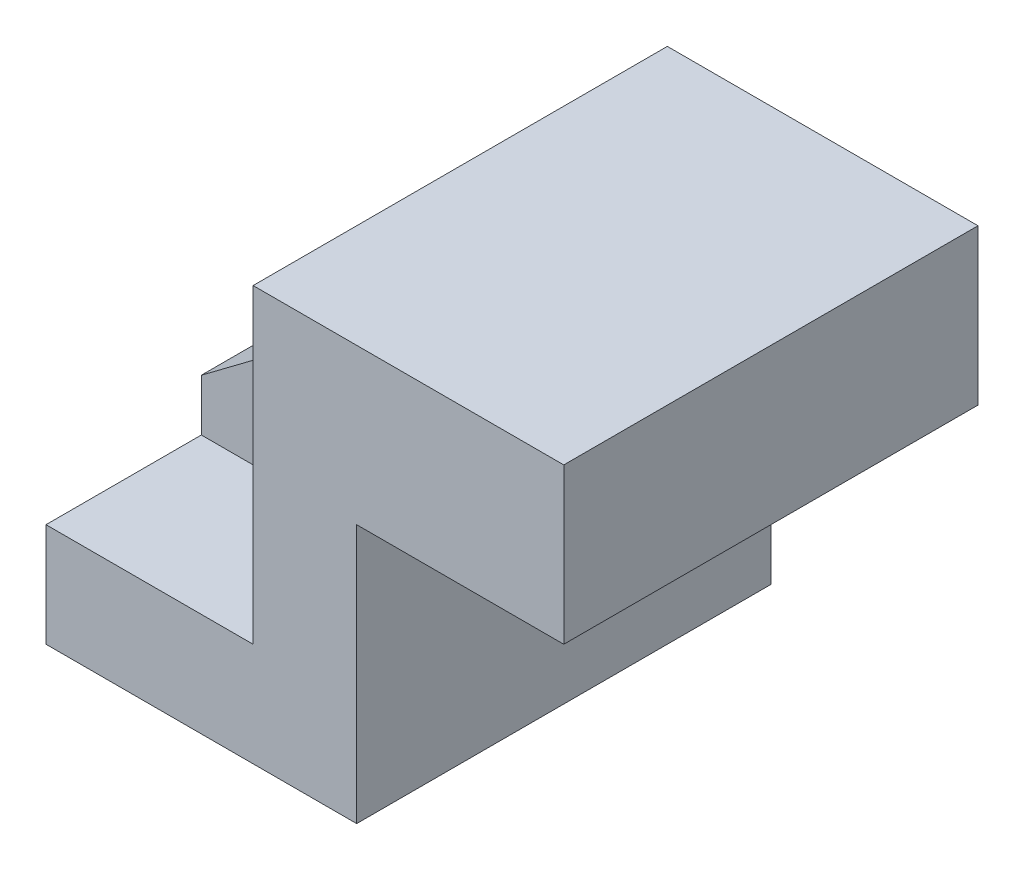
ISO-10303-21;
HEADER;
FILE_DESCRIPTION(('STEP AP214'),'2;1');
FILE_NAME('part.step','',(''),(''),'','','');
FILE_SCHEMA(('AUTOMOTIVE_DESIGN { 1 0 10303 214 1 1 1 1 }'));
ENDSEC;
DATA;
#1=APPLICATION_CONTEXT('core data for automotive mechanical design processes');
#2=APPLICATION_PROTOCOL_DEFINITION('international standard','automotive_design',2000,#1);
#3=PRODUCT_CONTEXT('',#1,'mechanical');
#4=PRODUCT('Part','Part','',(#3));
#5=PRODUCT_RELATED_PRODUCT_CATEGORY('part','',(#4));
#6=PRODUCT_DEFINITION_FORMATION('','',#4);
#7=PRODUCT_DEFINITION_CONTEXT('part definition',#1,'design');
#8=PRODUCT_DEFINITION('design','',#6,#7);
#9=PRODUCT_DEFINITION_SHAPE('','',#8);
#10=(LENGTH_UNIT() NAMED_UNIT(*) SI_UNIT(.MILLI.,.METRE.));
#11=(NAMED_UNIT(*) PLANE_ANGLE_UNIT() SI_UNIT($,.RADIAN.));
#12=(NAMED_UNIT(*) SI_UNIT($,.STERADIAN.) SOLID_ANGLE_UNIT());
#13=UNCERTAINTY_MEASURE_WITH_UNIT(LENGTH_MEASURE(1.E-05),#10,'distance_accuracy_value','');
#14=(GEOMETRIC_REPRESENTATION_CONTEXT(3) GLOBAL_UNCERTAINTY_ASSIGNED_CONTEXT((#13)) GLOBAL_UNIT_ASSIGNED_CONTEXT((#10,
#11,#12)) REPRESENTATION_CONTEXT('',''));
#15=CARTESIAN_POINT('',(0.,0.,0.));
#16=DIRECTION('',(0.,0.,1.));
#17=DIRECTION('',(1.,0.,0.));
#18=AXIS2_PLACEMENT_3D('',#15,#16,#17);
#19=CARTESIAN_POINT('',(0.,20.,40.));
#20=DIRECTION('',(0.,-1.,0.));
#21=DIRECTION('',(1.,0.,0.));
#22=AXIS2_PLACEMENT_3D('',#19,#20,#21);
#23=PLANE('',#22);
#24=DIRECTION('',(-1.,0.,0.));
#25=VECTOR('',#24,1.);
#26=CARTESIAN_POINT('',(0.,20.,-10.));
#27=LINE('',#26,#25);
#28=CARTESIAN_POINT('',(40.,20.,-10.));
#29=VERTEX_POINT('',#28);
#30=CARTESIAN_POINT('',(0.,20.,-10.));
#31=VERTEX_POINT('',#30);
#32=EDGE_CURVE('E152',#29,#31,#27,.T.);
#33=ORIENTED_EDGE('',*,*,#32,.F.);
#34=DIRECTION('',(0.,0.,-1.));
#35=VECTOR('',#34,1.);
#36=CARTESIAN_POINT('',(40.,20.,40.));
#37=LINE('',#36,#35);
#38=CARTESIAN_POINT('',(40.,20.,-40.));
#39=VERTEX_POINT('',#38);
#40=EDGE_CURVE('E176',#29,#39,#37,.T.);
#41=ORIENTED_EDGE('',*,*,#40,.T.);
#42=DIRECTION('',(-1.,0.,0.));
#43=VECTOR('',#42,1.);
#44=CARTESIAN_POINT('',(0.,20.,-40.));
#45=LINE('',#44,#43);
#46=CARTESIAN_POINT('',(0.,20.,-40.));
#47=VERTEX_POINT('',#46);
#48=EDGE_CURVE('E134',#39,#47,#45,.T.);
#49=ORIENTED_EDGE('',*,*,#48,.T.);
#50=DIRECTION('',(0.,0.,-1.));
#51=VECTOR('',#50,1.);
#52=CARTESIAN_POINT('',(0.,20.,40.));
#53=LINE('',#52,#51);
#54=EDGE_CURVE('E41',#31,#47,#53,.T.);
#55=ORIENTED_EDGE('',*,*,#54,.F.);
#56=EDGE_LOOP('',(#33,#41,#49,#55));
#57=FACE_BOUND('',#56,.T.);
#58=ADVANCED_FACE('F33',(#57),#23,.F.);
#59=CARTESIAN_POINT('',(40.,20.,40.));
#60=VERTEX_POINT('',#59);
#61=CARTESIAN_POINT('',(40.,20.,10.));
#62=VERTEX_POINT('',#61);
#63=EDGE_CURVE('E192',#60,#62,#37,.T.);
#64=ORIENTED_EDGE('',*,*,#63,.T.);
#65=DIRECTION('',(-1.,0.,0.));
#66=VECTOR('',#65,1.);
#67=CARTESIAN_POINT('',(0.,20.,10.));
#68=LINE('',#67,#66);
#69=CARTESIAN_POINT('',(0.,20.,10.));
#70=VERTEX_POINT('',#69);
#71=EDGE_CURVE('E55',#62,#70,#68,.T.);
#72=ORIENTED_EDGE('',*,*,#71,.T.);
#73=CARTESIAN_POINT('',(0.,20.,40.));
#74=VERTEX_POINT('',#73);
#75=EDGE_CURVE('E11',#74,#70,#53,.T.);
#76=ORIENTED_EDGE('',*,*,#75,.F.);
#77=DIRECTION('',(-1.,0.,0.));
#78=VECTOR('',#77,1.);
#79=CARTESIAN_POINT('',(0.,20.,40.));
#80=LINE('',#79,#78);
#81=EDGE_CURVE('E158',#60,#74,#80,.T.);
#82=ORIENTED_EDGE('',*,*,#81,.F.);
#83=EDGE_LOOP('',(#64,#72,#76,#82));
#84=FACE_BOUND('',#83,.T.);
#85=ADVANCED_FACE('F35',(#84),#23,.F.);
#86=CARTESIAN_POINT('',(0.,0.,40.));
#87=DIRECTION('',(1.,0.,0.));
#88=DIRECTION('',(0.,1.,0.));
#89=AXIS2_PLACEMENT_3D('',#86,#87,#88);
#90=PLANE('',#89);
#91=DIRECTION('',(0.,-1.,0.));
#92=VECTOR('',#91,1.);
#93=CARTESIAN_POINT('',(0.,0.,-40.));
#94=LINE('',#93,#92);
#95=CARTESIAN_POINT('',(0.,0.,-40.));
#96=VERTEX_POINT('',#95);
#97=EDGE_CURVE('E178',#47,#96,#94,.T.);
#98=ORIENTED_EDGE('',*,*,#97,.T.);
#99=DIRECTION('',(0.,0.,-1.));
#100=VECTOR('',#99,1.);
#101=CARTESIAN_POINT('',(0.,0.,40.));
#102=LINE('',#101,#100);
#103=CARTESIAN_POINT('',(0.,0.,40.));
#104=VERTEX_POINT('',#103);
#105=EDGE_CURVE('E208',#104,#96,#102,.T.);
#106=ORIENTED_EDGE('',*,*,#105,.F.);
#107=DIRECTION('',(0.,-1.,0.));
#108=VECTOR('',#107,1.);
#109=CARTESIAN_POINT('',(0.,0.,40.));
#110=LINE('',#109,#108);
#111=EDGE_CURVE('E161',#74,#104,#110,.T.);
#112=ORIENTED_EDGE('',*,*,#111,.F.);
#113=ORIENTED_EDGE('',*,*,#75,.T.);
#114=DIRECTION('',(0.,1.,0.));
#115=VECTOR('',#114,1.);
#116=CARTESIAN_POINT('',(0.,0.,10.));
#117=LINE('',#116,#115);
#118=CARTESIAN_POINT('',(0.,30.,10.));
#119=VERTEX_POINT('',#118);
#120=EDGE_CURVE('E140',#70,#119,#117,.T.);
#121=ORIENTED_EDGE('',*,*,#120,.T.);
#122=DIRECTION('',(0.,0.,-1.));
#123=VECTOR('',#122,1.);
#124=CARTESIAN_POINT('',(0.,30.,10.));
#125=LINE('',#124,#123);
#126=CARTESIAN_POINT('',(0.,30.,-10.));
#127=VERTEX_POINT('',#126);
#128=EDGE_CURVE('E123',#119,#127,#125,.T.);
#129=ORIENTED_EDGE('',*,*,#128,.T.);
#130=DIRECTION('',(0.,1.,0.));
#131=VECTOR('',#130,1.);
#132=CARTESIAN_POINT('',(0.,0.,-10.));
#133=LINE('',#132,#131);
#134=EDGE_CURVE('E150',#31,#127,#133,.T.);
#135=ORIENTED_EDGE('',*,*,#134,.F.);
#136=ORIENTED_EDGE('',*,*,#54,.T.);
#137=EDGE_LOOP('',(#98,#106,#112,#113,#121,#129,#135,#136));
#138=FACE_BOUND('',#137,.T.);
#139=ADVANCED_FACE('F144',(#138),#90,.F.);
#140=CARTESIAN_POINT('',(0.,0.,40.));
#141=DIRECTION('',(0.,1.,0.));
#142=DIRECTION('',(0.,0.,1.));
#143=AXIS2_PLACEMENT_3D('',#140,#141,#142);
#144=PLANE('',#143);
#145=DIRECTION('',(1.,0.,0.));
#146=VECTOR('',#145,1.);
#147=CARTESIAN_POINT('',(0.,0.,-40.));
#148=LINE('',#147,#146);
#149=CARTESIAN_POINT('',(60.,0.,-40.));
#150=VERTEX_POINT('',#149);
#151=EDGE_CURVE('E180',#96,#150,#148,.T.);
#152=ORIENTED_EDGE('',*,*,#151,.T.);
#153=DIRECTION('',(0.,0.,-1.));
#154=VECTOR('',#153,1.);
#155=CARTESIAN_POINT('',(60.,0.,40.));
#156=LINE('',#155,#154);
#157=CARTESIAN_POINT('',(60.,0.,40.));
#158=VERTEX_POINT('',#157);
#159=EDGE_CURVE('E206',#158,#150,#156,.T.);
#160=ORIENTED_EDGE('',*,*,#159,.F.);
#161=DIRECTION('',(1.,0.,0.));
#162=VECTOR('',#161,1.);
#163=CARTESIAN_POINT('',(0.,0.,40.));
#164=LINE('',#163,#162);
#165=EDGE_CURVE('E164',#104,#158,#164,.T.);
#166=ORIENTED_EDGE('',*,*,#165,.F.);
#167=ORIENTED_EDGE('',*,*,#105,.T.);
#168=EDGE_LOOP('',(#152,#160,#166,#167));
#169=FACE_BOUND('',#168,.T.);
#170=ADVANCED_FACE('F243',(#169),#144,.F.);
#171=CARTESIAN_POINT('',(60.,0.,40.));
#172=DIRECTION('',(-1.,0.,0.));
#173=DIRECTION('',(0.,0.,1.));
#174=AXIS2_PLACEMENT_3D('',#171,#172,#173);
#175=PLANE('',#174);
#176=DIRECTION('',(0.,1.,0.));
#177=VECTOR('',#176,1.);
#178=CARTESIAN_POINT('',(60.,0.,-40.));
#179=LINE('',#178,#177);
#180=CARTESIAN_POINT('',(60.,50.,-40.));
#181=VERTEX_POINT('',#180);
#182=EDGE_CURVE('E182',#150,#181,#179,.T.);
#183=ORIENTED_EDGE('',*,*,#182,.T.);
#184=DIRECTION('',(0.,0.,-1.));
#185=VECTOR('',#184,1.);
#186=CARTESIAN_POINT('',(60.,50.,40.));
#187=LINE('',#186,#185);
#188=CARTESIAN_POINT('',(60.,50.,40.));
#189=VERTEX_POINT('',#188);
#190=EDGE_CURVE('E203',#189,#181,#187,.T.);
#191=ORIENTED_EDGE('',*,*,#190,.F.);
#192=DIRECTION('',(0.,1.,0.));
#193=VECTOR('',#192,1.);
#194=CARTESIAN_POINT('',(60.,0.,40.));
#195=LINE('',#194,#193);
#196=EDGE_CURVE('E166',#158,#189,#195,.T.);
#197=ORIENTED_EDGE('',*,*,#196,.F.);
#198=ORIENTED_EDGE('',*,*,#159,.T.);
#199=EDGE_LOOP('',(#183,#191,#197,#198));
#200=FACE_BOUND('',#199,.T.);
#201=ADVANCED_FACE('F240',(#200),#175,.F.);
#202=CARTESIAN_POINT('',(0.,50.,40.));
#203=DIRECTION('',(0.,1.,0.));
#204=DIRECTION('',(0.,0.,1.));
#205=AXIS2_PLACEMENT_3D('',#202,#203,#204);
#206=PLANE('',#205);
#207=DIRECTION('',(1.,0.,0.));
#208=VECTOR('',#207,1.);
#209=CARTESIAN_POINT('',(0.,50.,-40.));
#210=LINE('',#209,#208);
#211=CARTESIAN_POINT('',(100.,50.,-40.));
#212=VERTEX_POINT('',#211);
#213=EDGE_CURVE('E184',#181,#212,#210,.T.);
#214=ORIENTED_EDGE('',*,*,#213,.T.);
#215=DIRECTION('',(0.,0.,-1.));
#216=VECTOR('',#215,1.);
#217=CARTESIAN_POINT('',(100.,50.,40.));
#218=LINE('',#217,#216);
#219=CARTESIAN_POINT('',(100.,50.,40.));
#220=VERTEX_POINT('',#219);
#221=EDGE_CURVE('E200',#220,#212,#218,.T.);
#222=ORIENTED_EDGE('',*,*,#221,.F.);
#223=DIRECTION('',(1.,0.,0.));
#224=VECTOR('',#223,1.);
#225=CARTESIAN_POINT('',(0.,50.,40.));
#226=LINE('',#225,#224);
#227=EDGE_CURVE('E168',#189,#220,#226,.T.);
#228=ORIENTED_EDGE('',*,*,#227,.F.);
#229=ORIENTED_EDGE('',*,*,#190,.T.);
#230=EDGE_LOOP('',(#214,#222,#228,#229));
#231=FACE_BOUND('',#230,.T.);
#232=ADVANCED_FACE('F237',(#231),#206,.F.);
#233=CARTESIAN_POINT('',(100.,0.,40.));
#234=DIRECTION('',(-1.,0.,0.));
#235=DIRECTION('',(0.,0.,1.));
#236=AXIS2_PLACEMENT_3D('',#233,#234,#235);
#237=PLANE('',#236);
#238=DIRECTION('',(0.,1.,0.));
#239=VECTOR('',#238,1.);
#240=CARTESIAN_POINT('',(100.,0.,-40.));
#241=LINE('',#240,#239);
#242=CARTESIAN_POINT('',(100.,80.,-40.));
#243=VERTEX_POINT('',#242);
#244=EDGE_CURVE('E186',#212,#243,#241,.T.);
#245=ORIENTED_EDGE('',*,*,#244,.T.);
#246=DIRECTION('',(0.,0.,-1.));
#247=VECTOR('',#246,1.);
#248=CARTESIAN_POINT('',(100.,80.,40.));
#249=LINE('',#248,#247);
#250=CARTESIAN_POINT('',(100.,80.,40.));
#251=VERTEX_POINT('',#250);
#252=EDGE_CURVE('E197',#251,#243,#249,.T.);
#253=ORIENTED_EDGE('',*,*,#252,.F.);
#254=DIRECTION('',(0.,1.,0.));
#255=VECTOR('',#254,1.);
#256=CARTESIAN_POINT('',(100.,0.,40.));
#257=LINE('',#256,#255);
#258=EDGE_CURVE('E170',#220,#251,#257,.T.);
#259=ORIENTED_EDGE('',*,*,#258,.F.);
#260=ORIENTED_EDGE('',*,*,#221,.T.);
#261=EDGE_LOOP('',(#245,#253,#259,#260));
#262=FACE_BOUND('',#261,.T.);
#263=ADVANCED_FACE('F233',(#262),#237,.F.);
#264=CARTESIAN_POINT('',(0.,80.,40.));
#265=DIRECTION('',(0.,-1.,0.));
#266=DIRECTION('',(1.,0.,0.));
#267=AXIS2_PLACEMENT_3D('',#264,#265,#266);
#268=PLANE('',#267);
#269=DIRECTION('',(-1.,0.,0.));
#270=VECTOR('',#269,1.);
#271=CARTESIAN_POINT('',(0.,80.,-40.));
#272=LINE('',#271,#270);
#273=CARTESIAN_POINT('',(40.,80.,-40.));
#274=VERTEX_POINT('',#273);
#275=EDGE_CURVE('E188',#243,#274,#272,.T.);
#276=ORIENTED_EDGE('',*,*,#275,.T.);
#277=DIRECTION('',(0.,0.,-1.));
#278=VECTOR('',#277,1.);
#279=CARTESIAN_POINT('',(40.,80.,40.));
#280=LINE('',#279,#278);
#281=CARTESIAN_POINT('',(40.,80.,40.));
#282=VERTEX_POINT('',#281);
#283=EDGE_CURVE('E194',#282,#274,#280,.T.);
#284=ORIENTED_EDGE('',*,*,#283,.F.);
#285=DIRECTION('',(-1.,0.,0.));
#286=VECTOR('',#285,1.);
#287=CARTESIAN_POINT('',(0.,80.,40.));
#288=LINE('',#287,#286);
#289=EDGE_CURVE('E172',#251,#282,#288,.T.);
#290=ORIENTED_EDGE('',*,*,#289,.F.);
#291=ORIENTED_EDGE('',*,*,#252,.T.);
#292=EDGE_LOOP('',(#276,#284,#290,#291));
#293=FACE_BOUND('',#292,.T.);
#294=ADVANCED_FACE('F228',(#293),#268,.F.);
#295=CARTESIAN_POINT('',(40.,0.,40.));
#296=DIRECTION('',(1.,0.,0.));
#297=DIRECTION('',(0.,0.,-1.));
#298=AXIS2_PLACEMENT_3D('',#295,#296,#297);
#299=PLANE('',#298);
#300=DIRECTION('',(0.,0.,-1.));
#301=VECTOR('',#300,1.);
#302=CARTESIAN_POINT('',(40.,60.,10.));
#303=LINE('',#302,#301);
#304=CARTESIAN_POINT('',(40.,60.,10.));
#305=VERTEX_POINT('',#304);
#306=CARTESIAN_POINT('',(40.,60.,-10.));
#307=VERTEX_POINT('',#306);
#308=EDGE_CURVE('E135',#305,#307,#303,.T.);
#309=ORIENTED_EDGE('',*,*,#308,.F.);
#310=DIRECTION('',(0.,-1.,0.));
#311=VECTOR('',#310,1.);
#312=CARTESIAN_POINT('',(40.,0.,10.));
#313=LINE('',#312,#311);
#314=EDGE_CURVE('E141',#305,#62,#313,.T.);
#315=ORIENTED_EDGE('',*,*,#314,.T.);
#316=ORIENTED_EDGE('',*,*,#63,.F.);
#317=DIRECTION('',(0.,-1.,0.));
#318=VECTOR('',#317,1.);
#319=CARTESIAN_POINT('',(40.,0.,40.));
#320=LINE('',#319,#318);
#321=EDGE_CURVE('E174',#282,#60,#320,.T.);
#322=ORIENTED_EDGE('',*,*,#321,.F.);
#323=ORIENTED_EDGE('',*,*,#283,.T.);
#324=DIRECTION('',(0.,-1.,0.));
#325=VECTOR('',#324,1.);
#326=CARTESIAN_POINT('',(40.,0.,-40.));
#327=LINE('',#326,#325);
#328=EDGE_CURVE('E162',#274,#39,#327,.T.);
#329=ORIENTED_EDGE('',*,*,#328,.T.);
#330=ORIENTED_EDGE('',*,*,#40,.F.);
#331=DIRECTION('',(0.,-1.,0.));
#332=VECTOR('',#331,1.);
#333=CARTESIAN_POINT('',(40.,0.,-10.));
#334=LINE('',#333,#332);
#335=EDGE_CURVE('E142',#307,#29,#334,.T.);
#336=ORIENTED_EDGE('',*,*,#335,.F.);
#337=EDGE_LOOP('',(#309,#315,#316,#322,#323,#329,#330,#336));
#338=FACE_BOUND('',#337,.T.);
#339=ADVANCED_FACE('F221',(#338),#299,.F.);
#340=CARTESIAN_POINT('',(0.,0.,40.));
#341=DIRECTION('',(0.,0.,1.));
#342=DIRECTION('',(1.,0.,0.));
#343=AXIS2_PLACEMENT_3D('',#340,#341,#342);
#344=PLANE('',#343);
#345=ORIENTED_EDGE('',*,*,#81,.T.);
#346=ORIENTED_EDGE('',*,*,#111,.T.);
#347=ORIENTED_EDGE('',*,*,#165,.T.);
#348=ORIENTED_EDGE('',*,*,#196,.T.);
#349=ORIENTED_EDGE('',*,*,#227,.T.);
#350=ORIENTED_EDGE('',*,*,#258,.T.);
#351=ORIENTED_EDGE('',*,*,#289,.T.);
#352=ORIENTED_EDGE('',*,*,#321,.T.);
#353=EDGE_LOOP('',(#345,#346,#347,#348,#349,#350,#351,#352));
#354=FACE_BOUND('',#353,.T.);
#355=ADVANCED_FACE('F245',(#354),#344,.T.);
#356=CARTESIAN_POINT('',(0.,0.,-40.));
#357=DIRECTION('',(0.,0.,1.));
#358=DIRECTION('',(1.,0.,0.));
#359=AXIS2_PLACEMENT_3D('',#356,#357,#358);
#360=PLANE('',#359);
#361=ORIENTED_EDGE('',*,*,#48,.F.);
#362=ORIENTED_EDGE('',*,*,#328,.F.);
#363=ORIENTED_EDGE('',*,*,#275,.F.);
#364=ORIENTED_EDGE('',*,*,#244,.F.);
#365=ORIENTED_EDGE('',*,*,#213,.F.);
#366=ORIENTED_EDGE('',*,*,#182,.F.);
#367=ORIENTED_EDGE('',*,*,#151,.F.);
#368=ORIENTED_EDGE('',*,*,#97,.F.);
#369=EDGE_LOOP('',(#361,#362,#363,#364,#365,#366,#367,#368));
#370=FACE_BOUND('',#369,.T.);
#371=ADVANCED_FACE('F217',(#370),#360,.F.);
#372=CARTESIAN_POINT('',(-14.4,19.2,10.));
#373=DIRECTION('',(-0.6,0.8,0.));
#374=DIRECTION('',(-0.8,-0.6,0.));
#375=AXIS2_PLACEMENT_3D('',#372,#373,#374);
#376=PLANE('',#375);
#377=DIRECTION('',(0.8,0.6,0.));
#378=VECTOR('',#377,1.);
#379=CARTESIAN_POINT('',(-14.4,19.2,-10.));
#380=LINE('',#379,#378);
#381=EDGE_CURVE('E130',#127,#307,#380,.T.);
#382=ORIENTED_EDGE('',*,*,#381,.F.);
#383=ORIENTED_EDGE('',*,*,#128,.F.);
#384=DIRECTION('',(0.8,0.6,0.));
#385=VECTOR('',#384,1.);
#386=CARTESIAN_POINT('',(-14.4,19.2,10.));
#387=LINE('',#386,#385);
#388=EDGE_CURVE('E127',#119,#305,#387,.T.);
#389=ORIENTED_EDGE('',*,*,#388,.T.);
#390=ORIENTED_EDGE('',*,*,#308,.T.);
#391=EDGE_LOOP('',(#382,#383,#389,#390));
#392=FACE_BOUND('',#391,.T.);
#393=ADVANCED_FACE('F125',(#392),#376,.T.);
#394=CARTESIAN_POINT('',(0.,0.,10.));
#395=DIRECTION('',(0.,0.,1.));
#396=DIRECTION('',(1.,0.,0.));
#397=AXIS2_PLACEMENT_3D('',#394,#395,#396);
#398=PLANE('',#397);
#399=ORIENTED_EDGE('',*,*,#388,.F.);
#400=ORIENTED_EDGE('',*,*,#120,.F.);
#401=ORIENTED_EDGE('',*,*,#71,.F.);
#402=ORIENTED_EDGE('',*,*,#314,.F.);
#403=EDGE_LOOP('',(#399,#400,#401,#402));
#404=FACE_BOUND('',#403,.T.);
#405=ADVANCED_FACE('F139',(#404),#398,.T.);
#406=CARTESIAN_POINT('',(0.,0.,-10.));
#407=DIRECTION('',(0.,0.,1.));
#408=DIRECTION('',(1.,0.,0.));
#409=AXIS2_PLACEMENT_3D('',#406,#407,#408);
#410=PLANE('',#409);
#411=ORIENTED_EDGE('',*,*,#381,.T.);
#412=ORIENTED_EDGE('',*,*,#335,.T.);
#413=ORIENTED_EDGE('',*,*,#32,.T.);
#414=ORIENTED_EDGE('',*,*,#134,.T.);
#415=EDGE_LOOP('',(#411,#412,#413,#414));
#416=FACE_BOUND('',#415,.T.);
#417=ADVANCED_FACE('F301',(#416),#410,.F.);
#418=CLOSED_SHELL('',(#58,#85,#139,#170,#201,#232,#263,#294,#339,#355,#371,#393,#405,#417));
#419=MANIFOLD_SOLID_BREP('B2',#418);
#420=ADVANCED_BREP_SHAPE_REPRESENTATION('',(#18,#419),#14);
#421=SHAPE_DEFINITION_REPRESENTATION(#9,#420);
ENDSEC;
END-ISO-10303-21;
